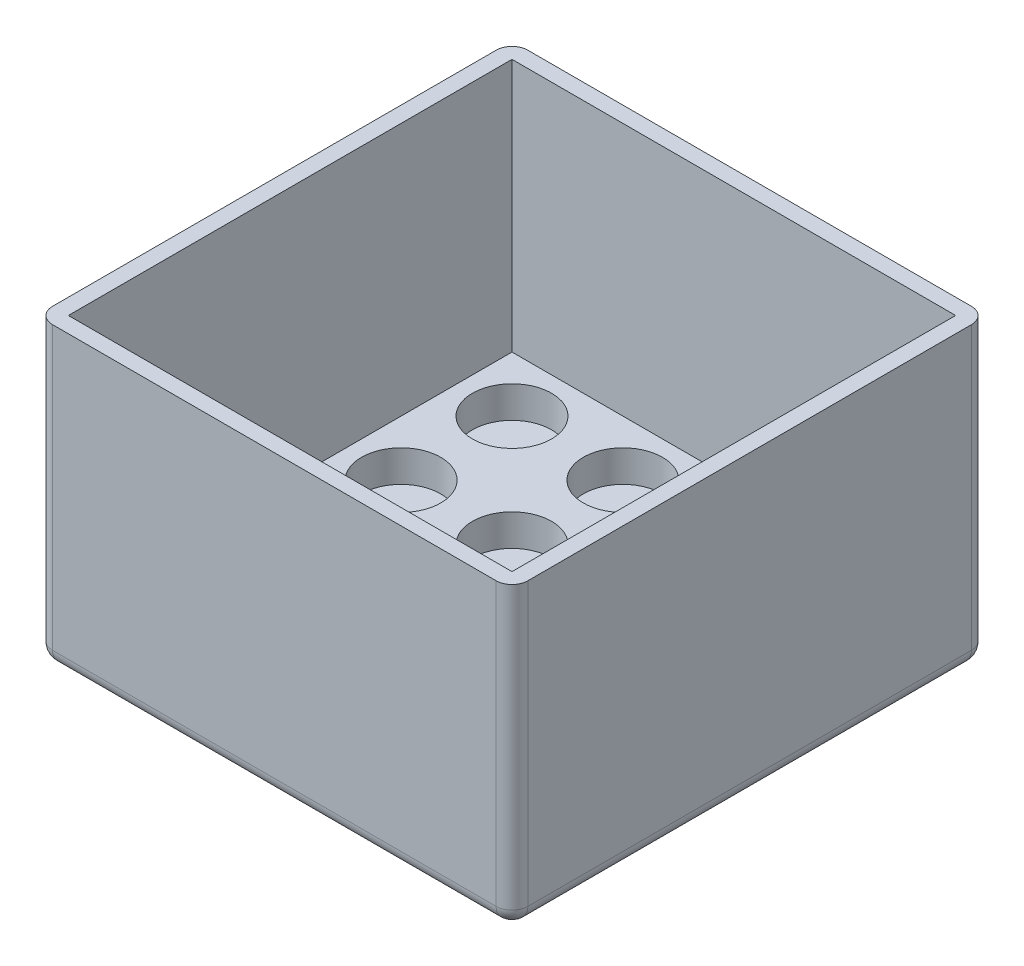
ISO-10303-21;
HEADER;
FILE_DESCRIPTION(('STEP AP214'),'2;1');
FILE_NAME('part.step','',(''),(''),'','','');
FILE_SCHEMA(('AUTOMOTIVE_DESIGN { 1 0 10303 214 1 1 1 1 }'));
ENDSEC;
DATA;
#1=APPLICATION_CONTEXT('core data for automotive mechanical design processes');
#2=APPLICATION_PROTOCOL_DEFINITION('international standard','automotive_design',2000,#1);
#3=PRODUCT_CONTEXT('',#1,'mechanical');
#4=PRODUCT('Part','Part','',(#3));
#5=PRODUCT_RELATED_PRODUCT_CATEGORY('part','',(#4));
#6=PRODUCT_DEFINITION_FORMATION('','',#4);
#7=PRODUCT_DEFINITION_CONTEXT('part definition',#1,'design');
#8=PRODUCT_DEFINITION('design','',#6,#7);
#9=PRODUCT_DEFINITION_SHAPE('','',#8);
#10=(LENGTH_UNIT() NAMED_UNIT(*) SI_UNIT(.MILLI.,.METRE.));
#11=(NAMED_UNIT(*) PLANE_ANGLE_UNIT() SI_UNIT($,.RADIAN.));
#12=(NAMED_UNIT(*) SI_UNIT($,.STERADIAN.) SOLID_ANGLE_UNIT());
#13=UNCERTAINTY_MEASURE_WITH_UNIT(LENGTH_MEASURE(1.E-05),#10,'distance_accuracy_value','');
#14=(GEOMETRIC_REPRESENTATION_CONTEXT(3) GLOBAL_UNCERTAINTY_ASSIGNED_CONTEXT((#13)) GLOBAL_UNIT_ASSIGNED_CONTEXT((#10,
#11,#12)) REPRESENTATION_CONTEXT('',''));
#15=CARTESIAN_POINT('',(0.,0.,0.));
#16=DIRECTION('',(0.,0.,1.));
#17=DIRECTION('',(1.,0.,0.));
#18=AXIS2_PLACEMENT_3D('',#15,#16,#17);
#19=CARTESIAN_POINT('',(0.,90.,0.));
#20=DIRECTION('',(0.,1.,0.));
#21=DIRECTION('',(0.,0.,1.));
#22=AXIS2_PLACEMENT_3D('',#19,#20,#21);
#23=PLANE('',#22);
#24=DIRECTION('',(-1.,0.,0.));
#25=VECTOR('',#24,1.);
#26=CARTESIAN_POINT('',(-5.,90.,-145.));
#27=LINE('',#26,#25);
#28=CARTESIAN_POINT('',(140.,90.,-145.));
#29=VERTEX_POINT('',#28);
#30=CARTESIAN_POINT('',(0.,90.,-145.));
#31=VERTEX_POINT('',#30);
#32=EDGE_CURVE('E243',#29,#31,#27,.T.);
#33=ORIENTED_EDGE('',*,*,#32,.T.);
#34=CARTESIAN_POINT('',(0.,90.,-140.));
#35=DIRECTION('',(0.,1.,0.));
#36=DIRECTION('',(0.,0.,1.));
#37=AXIS2_PLACEMENT_3D('',#34,#35,#36);
#38=CIRCLE('',#37,5.);
#39=CARTESIAN_POINT('',(-5.,90.,-140.));
#40=VERTEX_POINT('',#39);
#41=EDGE_CURVE('E11',#31,#40,#38,.T.);
#42=ORIENTED_EDGE('',*,*,#41,.T.);
#43=DIRECTION('',(0.,0.,1.));
#44=VECTOR('',#43,1.);
#45=CARTESIAN_POINT('',(-5.,90.,-145.));
#46=LINE('',#45,#44);
#47=CARTESIAN_POINT('',(-4.99999999999998,90.,0.));
#48=VERTEX_POINT('',#47);
#49=EDGE_CURVE('E234',#40,#48,#46,.T.);
#50=ORIENTED_EDGE('',*,*,#49,.T.);
#51=CARTESIAN_POINT('',(0.,90.,0.));
#52=DIRECTION('',(0.,1.,0.));
#53=DIRECTION('',(0.,0.,1.));
#54=AXIS2_PLACEMENT_3D('',#51,#52,#53);
#55=CIRCLE('',#54,5.);
#56=CARTESIAN_POINT('',(0.,90.,5.));
#57=VERTEX_POINT('',#56);
#58=EDGE_CURVE('E278',#48,#57,#55,.T.);
#59=ORIENTED_EDGE('',*,*,#58,.T.);
#60=DIRECTION('',(1.,0.,0.));
#61=VECTOR('',#60,1.);
#62=CARTESIAN_POINT('',(-4.99999999999998,90.,5.));
#63=LINE('',#62,#61);
#64=CARTESIAN_POINT('',(140.,90.,5.));
#65=VERTEX_POINT('',#64);
#66=EDGE_CURVE('E237',#57,#65,#63,.T.);
#67=ORIENTED_EDGE('',*,*,#66,.T.);
#68=CARTESIAN_POINT('',(140.,90.,0.));
#69=DIRECTION('',(0.,1.,0.));
#70=DIRECTION('',(0.,0.,1.));
#71=AXIS2_PLACEMENT_3D('',#68,#69,#70);
#72=CIRCLE('',#71,5.);
#73=CARTESIAN_POINT('',(145.,90.,0.));
#74=VERTEX_POINT('',#73);
#75=EDGE_CURVE('E280',#65,#74,#72,.T.);
#76=ORIENTED_EDGE('',*,*,#75,.T.);
#77=DIRECTION('',(0.,0.,-1.));
#78=VECTOR('',#77,1.);
#79=CARTESIAN_POINT('',(145.,90.,-145.));
#80=LINE('',#79,#78);
#81=CARTESIAN_POINT('',(145.,90.,-140.));
#82=VERTEX_POINT('',#81);
#83=EDGE_CURVE('E240',#74,#82,#80,.T.);
#84=ORIENTED_EDGE('',*,*,#83,.T.);
#85=CARTESIAN_POINT('',(140.,90.,-140.));
#86=DIRECTION('',(0.,1.,0.));
#87=DIRECTION('',(0.,0.,1.));
#88=AXIS2_PLACEMENT_3D('',#85,#86,#87);
#89=CIRCLE('',#88,5.);
#90=EDGE_CURVE('E50',#82,#29,#89,.T.);
#91=ORIENTED_EDGE('',*,*,#90,.T.);
#92=EDGE_LOOP('',(#33,#42,#50,#59,#67,#76,#84,#91));
#93=FACE_BOUND('',#92,.T.);
#94=DIRECTION('',(1.,0.,0.));
#95=VECTOR('',#94,1.);
#96=CARTESIAN_POINT('',(0.,90.,0.));
#97=LINE('',#96,#95);
#98=CARTESIAN_POINT('',(0.,90.,0.));
#99=VERTEX_POINT('',#98);
#100=CARTESIAN_POINT('',(140.,90.,0.));
#101=VERTEX_POINT('',#100);
#102=EDGE_CURVE('E223',#99,#101,#97,.T.);
#103=ORIENTED_EDGE('',*,*,#102,.F.);
#104=DIRECTION('',(0.,0.,1.));
#105=VECTOR('',#104,1.);
#106=CARTESIAN_POINT('',(0.,90.,0.));
#107=LINE('',#106,#105);
#108=CARTESIAN_POINT('',(0.,90.,-140.));
#109=VERTEX_POINT('',#108);
#110=EDGE_CURVE('E172',#109,#99,#107,.T.);
#111=ORIENTED_EDGE('',*,*,#110,.F.);
#112=DIRECTION('',(-1.,0.,0.));
#113=VECTOR('',#112,1.);
#114=CARTESIAN_POINT('',(0.,90.,-140.));
#115=LINE('',#114,#113);
#116=CARTESIAN_POINT('',(140.,90.,-140.));
#117=VERTEX_POINT('',#116);
#118=EDGE_CURVE('E148',#117,#109,#115,.T.);
#119=ORIENTED_EDGE('',*,*,#118,.F.);
#120=DIRECTION('',(0.,0.,-1.));
#121=VECTOR('',#120,1.);
#122=CARTESIAN_POINT('',(140.,90.,0.));
#123=LINE('',#122,#121);
#124=EDGE_CURVE('E225',#101,#117,#123,.T.);
#125=ORIENTED_EDGE('',*,*,#124,.F.);
#126=EDGE_LOOP('',(#103,#111,#119,#125));
#127=FACE_BOUND('',#126,.T.);
#128=ADVANCED_FACE('F41',(#93,#127),#23,.T.);
#129=CARTESIAN_POINT('',(-5.,90.,-145.));
#130=DIRECTION('',(1.,0.,0.));
#131=DIRECTION('',(0.,0.,-1.));
#132=AXIS2_PLACEMENT_3D('',#129,#130,#131);
#133=PLANE('',#132);
#134=ORIENTED_EDGE('',*,*,#49,.F.);
#135=DIRECTION('',(0.,-1.,0.));
#136=VECTOR('',#135,1.);
#137=CARTESIAN_POINT('',(-5.,90.,-140.));
#138=LINE('',#137,#136);
#139=CARTESIAN_POINT('',(-5.,1.,-140.));
#140=VERTEX_POINT('',#139);
#141=EDGE_CURVE('E272',#40,#140,#138,.T.);
#142=ORIENTED_EDGE('',*,*,#141,.T.);
#143=DIRECTION('',(0.,0.,-1.));
#144=VECTOR('',#143,1.);
#145=CARTESIAN_POINT('',(-4.99999999999998,1.,5.));
#146=LINE('',#145,#144);
#147=CARTESIAN_POINT('',(-4.99999999999998,1.,0.));
#148=VERTEX_POINT('',#147);
#149=EDGE_CURVE('E270',#140,#148,#146,.F.);
#150=ORIENTED_EDGE('',*,*,#149,.T.);
#151=DIRECTION('',(0.,-1.,0.));
#152=VECTOR('',#151,1.);
#153=CARTESIAN_POINT('',(-4.99999999999998,90.,0.));
#154=LINE('',#153,#152);
#155=EDGE_CURVE('E268',#148,#48,#154,.F.);
#156=ORIENTED_EDGE('',*,*,#155,.T.);
#157=EDGE_LOOP('',(#134,#142,#150,#156));
#158=FACE_BOUND('',#157,.T.);
#159=ADVANCED_FACE('F338',(#158),#133,.F.);
#160=CARTESIAN_POINT('',(-4.99999999999998,90.,5.));
#161=DIRECTION('',(0.,0.,-1.));
#162=DIRECTION('',(-1.,0.,0.));
#163=AXIS2_PLACEMENT_3D('',#160,#161,#162);
#164=PLANE('',#163);
#165=DIRECTION('',(-1.,0.,0.));
#166=VECTOR('',#165,1.);
#167=CARTESIAN_POINT('',(145.,1.,5.));
#168=LINE('',#167,#166);
#169=CARTESIAN_POINT('',(0.,1.,5.));
#170=VERTEX_POINT('',#169);
#171=CARTESIAN_POINT('',(140.,1.,5.));
#172=VERTEX_POINT('',#171);
#173=EDGE_CURVE('E264',#170,#172,#168,.F.);
#174=ORIENTED_EDGE('',*,*,#173,.T.);
#175=DIRECTION('',(0.,-1.,0.));
#176=VECTOR('',#175,1.);
#177=CARTESIAN_POINT('',(140.,90.,5.));
#178=LINE('',#177,#176);
#179=EDGE_CURVE('E266',#172,#65,#178,.F.);
#180=ORIENTED_EDGE('',*,*,#179,.T.);
#181=ORIENTED_EDGE('',*,*,#66,.F.);
#182=DIRECTION('',(0.,-1.,0.));
#183=VECTOR('',#182,1.);
#184=CARTESIAN_POINT('',(0.,90.,5.));
#185=LINE('',#184,#183);
#186=EDGE_CURVE('E262',#57,#170,#185,.T.);
#187=ORIENTED_EDGE('',*,*,#186,.T.);
#188=EDGE_LOOP('',(#174,#180,#181,#187));
#189=FACE_BOUND('',#188,.T.);
#190=ADVANCED_FACE('F350',(#189),#164,.F.);
#191=CARTESIAN_POINT('',(145.,90.,-145.));
#192=DIRECTION('',(-1.,0.,0.));
#193=DIRECTION('',(0.,0.,1.));
#194=AXIS2_PLACEMENT_3D('',#191,#192,#193);
#195=PLANE('',#194);
#196=DIRECTION('',(0.,0.,1.));
#197=VECTOR('',#196,1.);
#198=CARTESIAN_POINT('',(145.,1.,-145.));
#199=LINE('',#198,#197);
#200=CARTESIAN_POINT('',(145.,1.,0.));
#201=VERTEX_POINT('',#200);
#202=CARTESIAN_POINT('',(145.,1.,-140.));
#203=VERTEX_POINT('',#202);
#204=EDGE_CURVE('E257',#201,#203,#199,.F.);
#205=ORIENTED_EDGE('',*,*,#204,.T.);
#206=DIRECTION('',(0.,-1.,0.));
#207=VECTOR('',#206,1.);
#208=CARTESIAN_POINT('',(145.,90.,-140.));
#209=LINE('',#208,#207);
#210=EDGE_CURVE('E260',#203,#82,#209,.F.);
#211=ORIENTED_EDGE('',*,*,#210,.T.);
#212=ORIENTED_EDGE('',*,*,#83,.F.);
#213=DIRECTION('',(0.,-1.,0.));
#214=VECTOR('',#213,1.);
#215=CARTESIAN_POINT('',(145.,90.,0.));
#216=LINE('',#215,#214);
#217=EDGE_CURVE('E255',#74,#201,#216,.T.);
#218=ORIENTED_EDGE('',*,*,#217,.T.);
#219=EDGE_LOOP('',(#205,#211,#212,#218));
#220=FACE_BOUND('',#219,.T.);
#221=ADVANCED_FACE('F367',(#220),#195,.F.);
#222=CARTESIAN_POINT('',(-5.,90.,-145.));
#223=DIRECTION('',(0.,0.,1.));
#224=DIRECTION('',(1.,0.,0.));
#225=AXIS2_PLACEMENT_3D('',#222,#223,#224);
#226=PLANE('',#225);
#227=DIRECTION('',(1.,0.,0.));
#228=VECTOR('',#227,1.);
#229=CARTESIAN_POINT('',(-4.99999999999998,1.,-145.));
#230=LINE('',#229,#228);
#231=CARTESIAN_POINT('',(140.,1.,-145.));
#232=VERTEX_POINT('',#231);
#233=CARTESIAN_POINT('',(0.,1.,-145.));
#234=VERTEX_POINT('',#233);
#235=EDGE_CURVE('E58',#232,#234,#230,.F.);
#236=ORIENTED_EDGE('',*,*,#235,.T.);
#237=DIRECTION('',(0.,-1.,0.));
#238=VECTOR('',#237,1.);
#239=CARTESIAN_POINT('',(0.,90.,-145.));
#240=LINE('',#239,#238);
#241=EDGE_CURVE('E276',#234,#31,#240,.F.);
#242=ORIENTED_EDGE('',*,*,#241,.T.);
#243=ORIENTED_EDGE('',*,*,#32,.F.);
#244=DIRECTION('',(0.,-1.,0.));
#245=VECTOR('',#244,1.);
#246=CARTESIAN_POINT('',(140.,90.,-145.));
#247=LINE('',#246,#245);
#248=EDGE_CURVE('E63',#29,#232,#247,.T.);
#249=ORIENTED_EDGE('',*,*,#248,.T.);
#250=EDGE_LOOP('',(#236,#242,#243,#249));
#251=FACE_BOUND('',#250,.T.);
#252=ADVANCED_FACE('F392',(#251),#226,.F.);
#253=CARTESIAN_POINT('',(0.,90.,0.));
#254=DIRECTION('',(1.,0.,0.));
#255=DIRECTION('',(0.,0.,-1.));
#256=AXIS2_PLACEMENT_3D('',#253,#254,#255);
#257=PLANE('',#256);
#258=DIRECTION('',(0.,0.,1.));
#259=VECTOR('',#258,1.);
#260=CARTESIAN_POINT('',(0.,10.,0.));
#261=LINE('',#260,#259);
#262=CARTESIAN_POINT('',(0.,10.,-140.));
#263=VERTEX_POINT('',#262);
#264=CARTESIAN_POINT('',(0.,10.,0.));
#265=VERTEX_POINT('',#264);
#266=EDGE_CURVE('E155',#263,#265,#261,.T.);
#267=ORIENTED_EDGE('',*,*,#266,.F.);
#268=DIRECTION('',(0.,-1.,0.));
#269=VECTOR('',#268,1.);
#270=CARTESIAN_POINT('',(0.,90.,-140.));
#271=LINE('',#270,#269);
#272=EDGE_CURVE('E141',#109,#263,#271,.T.);
#273=ORIENTED_EDGE('',*,*,#272,.F.);
#274=ORIENTED_EDGE('',*,*,#110,.T.);
#275=DIRECTION('',(0.,-1.,0.));
#276=VECTOR('',#275,1.);
#277=CARTESIAN_POINT('',(0.,90.,0.));
#278=LINE('',#277,#276);
#279=EDGE_CURVE('E158',#99,#265,#278,.T.);
#280=ORIENTED_EDGE('',*,*,#279,.T.);
#281=EDGE_LOOP('',(#267,#273,#274,#280));
#282=FACE_BOUND('',#281,.T.);
#283=ADVANCED_FACE('F156',(#282),#257,.T.);
#284=CARTESIAN_POINT('',(0.,90.,0.));
#285=DIRECTION('',(0.,0.,-1.));
#286=DIRECTION('',(-1.,0.,0.));
#287=AXIS2_PLACEMENT_3D('',#284,#285,#286);
#288=PLANE('',#287);
#289=DIRECTION('',(1.,0.,0.));
#290=VECTOR('',#289,1.);
#291=CARTESIAN_POINT('',(0.,10.,0.));
#292=LINE('',#291,#290);
#293=CARTESIAN_POINT('',(140.,10.,0.));
#294=VERTEX_POINT('',#293);
#295=EDGE_CURVE('E161',#265,#294,#292,.T.);
#296=ORIENTED_EDGE('',*,*,#295,.F.);
#297=ORIENTED_EDGE('',*,*,#279,.F.);
#298=ORIENTED_EDGE('',*,*,#102,.T.);
#299=DIRECTION('',(0.,-1.,0.));
#300=VECTOR('',#299,1.);
#301=CARTESIAN_POINT('',(140.,90.,0.));
#302=LINE('',#301,#300);
#303=EDGE_CURVE('E230',#101,#294,#302,.T.);
#304=ORIENTED_EDGE('',*,*,#303,.T.);
#305=EDGE_LOOP('',(#296,#297,#298,#304));
#306=FACE_BOUND('',#305,.T.);
#307=ADVANCED_FACE('F892',(#306),#288,.T.);
#308=CARTESIAN_POINT('',(140.,90.,0.));
#309=DIRECTION('',(-1.,0.,0.));
#310=DIRECTION('',(0.,0.,1.));
#311=AXIS2_PLACEMENT_3D('',#308,#309,#310);
#312=PLANE('',#311);
#313=DIRECTION('',(0.,0.,-1.));
#314=VECTOR('',#313,1.);
#315=CARTESIAN_POINT('',(140.,10.,0.));
#316=LINE('',#315,#314);
#317=CARTESIAN_POINT('',(140.,10.,-140.));
#318=VERTEX_POINT('',#317);
#319=EDGE_CURVE('E165',#294,#318,#316,.T.);
#320=ORIENTED_EDGE('',*,*,#319,.F.);
#321=ORIENTED_EDGE('',*,*,#303,.F.);
#322=ORIENTED_EDGE('',*,*,#124,.T.);
#323=DIRECTION('',(0.,-1.,0.));
#324=VECTOR('',#323,1.);
#325=CARTESIAN_POINT('',(140.,90.,-140.));
#326=LINE('',#325,#324);
#327=EDGE_CURVE('E151',#117,#318,#326,.T.);
#328=ORIENTED_EDGE('',*,*,#327,.T.);
#329=EDGE_LOOP('',(#320,#321,#322,#328));
#330=FACE_BOUND('',#329,.T.);
#331=ADVANCED_FACE('F882',(#330),#312,.T.);
#332=CARTESIAN_POINT('',(0.,90.,-140.));
#333=DIRECTION('',(0.,0.,1.));
#334=DIRECTION('',(1.,0.,0.));
#335=AXIS2_PLACEMENT_3D('',#332,#333,#334);
#336=PLANE('',#335);
#337=DIRECTION('',(-1.,0.,0.));
#338=VECTOR('',#337,1.);
#339=CARTESIAN_POINT('',(0.,10.,-140.));
#340=LINE('',#339,#338);
#341=EDGE_CURVE('E145',#318,#263,#340,.T.);
#342=ORIENTED_EDGE('',*,*,#341,.F.);
#343=ORIENTED_EDGE('',*,*,#327,.F.);
#344=ORIENTED_EDGE('',*,*,#118,.T.);
#345=ORIENTED_EDGE('',*,*,#272,.T.);
#346=EDGE_LOOP('',(#342,#343,#344,#345));
#347=FACE_BOUND('',#346,.T.);
#348=ADVANCED_FACE('F143',(#347),#336,.T.);
#349=CARTESIAN_POINT('',(0.,-4.,0.));
#350=DIRECTION('',(0.,-1.,0.));
#351=DIRECTION('',(0.,0.,-1.));
#352=AXIS2_PLACEMENT_3D('',#349,#350,#351);
#353=PLANE('',#352);
#354=DIRECTION('',(1.,0.,0.));
#355=VECTOR('',#354,1.);
#356=CARTESIAN_POINT('',(145.,-4.,-140.));
#357=LINE('',#356,#355);
#358=CARTESIAN_POINT('',(0.,-4.,-140.));
#359=VERTEX_POINT('',#358);
#360=CARTESIAN_POINT('',(140.,-4.,-140.));
#361=VERTEX_POINT('',#360);
#362=EDGE_CURVE('E246',#359,#361,#357,.T.);
#363=ORIENTED_EDGE('',*,*,#362,.T.);
#364=DIRECTION('',(0.,0.,1.));
#365=VECTOR('',#364,1.);
#366=CARTESIAN_POINT('',(140.,-4.,5.));
#367=LINE('',#366,#365);
#368=CARTESIAN_POINT('',(140.,-4.,0.));
#369=VERTEX_POINT('',#368);
#370=EDGE_CURVE('E252',#361,#369,#367,.T.);
#371=ORIENTED_EDGE('',*,*,#370,.T.);
#372=DIRECTION('',(-1.,0.,0.));
#373=VECTOR('',#372,1.);
#374=CARTESIAN_POINT('',(-4.99999999999998,-4.,0.));
#375=LINE('',#374,#373);
#376=CARTESIAN_POINT('',(0.,-4.,0.));
#377=VERTEX_POINT('',#376);
#378=EDGE_CURVE('E250',#369,#377,#375,.T.);
#379=ORIENTED_EDGE('',*,*,#378,.T.);
#380=DIRECTION('',(0.,0.,-1.));
#381=VECTOR('',#380,1.);
#382=CARTESIAN_POINT('',(0.,-4.,-145.));
#383=LINE('',#382,#381);
#384=EDGE_CURVE('E248',#377,#359,#383,.T.);
#385=ORIENTED_EDGE('',*,*,#384,.T.);
#386=EDGE_LOOP('',(#363,#371,#379,#385));
#387=FACE_BOUND('',#386,.T.);
#388=ADVANCED_FACE('F327',(#387),#353,.T.);
#389=CARTESIAN_POINT('',(17.4999999999999,10.,-122.5));
#390=DIRECTION('',(0.,-1.,0.));
#391=DIRECTION('',(0.,0.,-1.));
#392=AXIS2_PLACEMENT_3D('',#389,#390,#391);
#393=CYLINDRICAL_SURFACE('',#392,12.5);
#394=CARTESIAN_POINT('',(17.4999999999999,10.,-122.5));
#395=DIRECTION('',(0.,1.,0.));
#396=DIRECTION('',(0.,0.,1.));
#397=AXIS2_PLACEMENT_3D('',#394,#395,#396);
#398=CIRCLE('',#397,12.5);
#399=CARTESIAN_POINT('',(17.4999999999999,10.,-110.));
#400=VERTEX_POINT('',#399);
#401=EDGE_CURVE('E167',#400,#400,#398,.T.);
#402=ORIENTED_EDGE('',*,*,#401,.T.);
#403=EDGE_LOOP('',(#402));
#404=FACE_BOUND('',#403,.T.);
#405=CARTESIAN_POINT('',(17.4999999999999,0.,-122.5));
#406=DIRECTION('',(0.,1.,0.));
#407=DIRECTION('',(0.,0.,1.));
#408=AXIS2_PLACEMENT_3D('',#405,#406,#407);
#409=CIRCLE('',#408,12.5);
#410=CARTESIAN_POINT('',(17.4999999999999,0.,-110.));
#411=VERTEX_POINT('',#410);
#412=EDGE_CURVE('E218',#411,#411,#409,.T.);
#413=ORIENTED_EDGE('',*,*,#412,.F.);
#414=EDGE_LOOP('',(#413));
#415=FACE_BOUND('',#414,.T.);
#416=ADVANCED_FACE('F503',(#404,#415),#393,.F.);
#417=CARTESIAN_POINT('',(52.5,10.,-122.5));
#418=DIRECTION('',(0.,-1.,0.));
#419=DIRECTION('',(0.,0.,-1.));
#420=AXIS2_PLACEMENT_3D('',#417,#418,#419);
#421=CYLINDRICAL_SURFACE('',#420,12.5);
#422=CARTESIAN_POINT('',(52.5,10.,-122.5));
#423=DIRECTION('',(0.,1.,0.));
#424=DIRECTION('',(0.,0.,1.));
#425=AXIS2_PLACEMENT_3D('',#422,#423,#424);
#426=CIRCLE('',#425,12.5);
#427=CARTESIAN_POINT('',(52.5,10.,-110.));
#428=VERTEX_POINT('',#427);
#429=EDGE_CURVE('E979',#428,#428,#426,.T.);
#430=ORIENTED_EDGE('',*,*,#429,.T.);
#431=EDGE_LOOP('',(#430));
#432=FACE_BOUND('',#431,.T.);
#433=CARTESIAN_POINT('',(52.5,0.,-122.5));
#434=DIRECTION('',(0.,1.,0.));
#435=DIRECTION('',(0.,0.,1.));
#436=AXIS2_PLACEMENT_3D('',#433,#434,#435);
#437=CIRCLE('',#436,12.5);
#438=CARTESIAN_POINT('',(52.5,0.,-110.));
#439=VERTEX_POINT('',#438);
#440=EDGE_CURVE('E215',#439,#439,#437,.T.);
#441=ORIENTED_EDGE('',*,*,#440,.F.);
#442=EDGE_LOOP('',(#441));
#443=FACE_BOUND('',#442,.T.);
#444=ADVANCED_FACE('F855',(#432,#443),#421,.F.);
#445=CARTESIAN_POINT('',(87.5,10.,-122.500000000001));
#446=DIRECTION('',(0.,-1.,0.));
#447=DIRECTION('',(0.,0.,-1.));
#448=AXIS2_PLACEMENT_3D('',#445,#446,#447);
#449=CYLINDRICAL_SURFACE('',#448,12.5);
#450=CARTESIAN_POINT('',(87.5,10.,-122.500000000001));
#451=DIRECTION('',(0.,1.,0.));
#452=DIRECTION('',(0.,0.,1.));
#453=AXIS2_PLACEMENT_3D('',#450,#451,#452);
#454=CIRCLE('',#453,12.5);
#455=CARTESIAN_POINT('',(87.5,10.,-110.000000000001));
#456=VERTEX_POINT('',#455);
#457=EDGE_CURVE('E981',#456,#456,#454,.T.);
#458=ORIENTED_EDGE('',*,*,#457,.T.);
#459=EDGE_LOOP('',(#458));
#460=FACE_BOUND('',#459,.T.);
#461=CARTESIAN_POINT('',(87.5,0.,-122.500000000001));
#462=DIRECTION('',(0.,1.,0.));
#463=DIRECTION('',(0.,0.,1.));
#464=AXIS2_PLACEMENT_3D('',#461,#462,#463);
#465=CIRCLE('',#464,12.5);
#466=CARTESIAN_POINT('',(87.5,0.,-110.000000000001));
#467=VERTEX_POINT('',#466);
#468=EDGE_CURVE('E212',#467,#467,#465,.T.);
#469=ORIENTED_EDGE('',*,*,#468,.F.);
#470=EDGE_LOOP('',(#469));
#471=FACE_BOUND('',#470,.T.);
#472=ADVANCED_FACE('F844',(#460,#471),#449,.F.);
#473=CARTESIAN_POINT('',(122.5,10.,-122.500000000001));
#474=DIRECTION('',(0.,-1.,0.));
#475=DIRECTION('',(0.,0.,-1.));
#476=AXIS2_PLACEMENT_3D('',#473,#474,#475);
#477=CYLINDRICAL_SURFACE('',#476,12.5);
#478=CARTESIAN_POINT('',(122.5,10.,-122.500000000001));
#479=DIRECTION('',(0.,1.,0.));
#480=DIRECTION('',(0.,0.,1.));
#481=AXIS2_PLACEMENT_3D('',#478,#479,#480);
#482=CIRCLE('',#481,12.5);
#483=CARTESIAN_POINT('',(122.5,10.,-110.000000000002));
#484=VERTEX_POINT('',#483);
#485=EDGE_CURVE('E986',#484,#484,#482,.T.);
#486=ORIENTED_EDGE('',*,*,#485,.T.);
#487=EDGE_LOOP('',(#486));
#488=FACE_BOUND('',#487,.T.);
#489=CARTESIAN_POINT('',(122.5,0.,-122.500000000001));
#490=DIRECTION('',(0.,1.,0.));
#491=DIRECTION('',(0.,0.,1.));
#492=AXIS2_PLACEMENT_3D('',#489,#490,#491);
#493=CIRCLE('',#492,12.5);
#494=CARTESIAN_POINT('',(122.5,0.,-110.000000000002));
#495=VERTEX_POINT('',#494);
#496=EDGE_CURVE('E209',#495,#495,#493,.T.);
#497=ORIENTED_EDGE('',*,*,#496,.F.);
#498=EDGE_LOOP('',(#497));
#499=FACE_BOUND('',#498,.T.);
#500=ADVANCED_FACE('F833',(#488,#499),#477,.F.);
#501=CARTESIAN_POINT('',(52.5000000000003,10.,-87.5000000000005));
#502=DIRECTION('',(0.,-1.,0.));
#503=DIRECTION('',(0.,0.,-1.));
#504=AXIS2_PLACEMENT_3D('',#501,#502,#503);
#505=CYLINDRICAL_SURFACE('',#504,12.5);
#506=CARTESIAN_POINT('',(52.5000000000003,10.,-87.5000000000005));
#507=DIRECTION('',(0.,1.,0.));
#508=DIRECTION('',(0.,0.,1.));
#509=AXIS2_PLACEMENT_3D('',#506,#507,#508);
#510=CIRCLE('',#509,12.5);
#511=CARTESIAN_POINT('',(52.5000000000003,10.,-75.0000000000005));
#512=VERTEX_POINT('',#511);
#513=EDGE_CURVE('E989',#512,#512,#510,.T.);
#514=ORIENTED_EDGE('',*,*,#513,.T.);
#515=EDGE_LOOP('',(#514));
#516=FACE_BOUND('',#515,.T.);
#517=CARTESIAN_POINT('',(52.5000000000003,0.,-87.5000000000005));
#518=DIRECTION('',(0.,1.,0.));
#519=DIRECTION('',(0.,0.,1.));
#520=AXIS2_PLACEMENT_3D('',#517,#518,#519);
#521=CIRCLE('',#520,12.5);
#522=CARTESIAN_POINT('',(52.5000000000003,0.,-75.0000000000005));
#523=VERTEX_POINT('',#522);
#524=EDGE_CURVE('E206',#523,#523,#521,.T.);
#525=ORIENTED_EDGE('',*,*,#524,.F.);
#526=EDGE_LOOP('',(#525));
#527=FACE_BOUND('',#526,.T.);
#528=ADVANCED_FACE('F822',(#516,#527),#505,.F.);
#529=CARTESIAN_POINT('',(87.5000000000003,10.,-87.500000000001));
#530=DIRECTION('',(0.,-1.,0.));
#531=DIRECTION('',(0.,0.,-1.));
#532=AXIS2_PLACEMENT_3D('',#529,#530,#531);
#533=CYLINDRICAL_SURFACE('',#532,12.5);
#534=CARTESIAN_POINT('',(87.5000000000003,10.,-87.500000000001));
#535=DIRECTION('',(0.,1.,0.));
#536=DIRECTION('',(0.,0.,1.));
#537=AXIS2_PLACEMENT_3D('',#534,#535,#536);
#538=CIRCLE('',#537,12.5);
#539=CARTESIAN_POINT('',(87.5000000000003,10.,-75.000000000001));
#540=VERTEX_POINT('',#539);
#541=EDGE_CURVE('E992',#540,#540,#538,.T.);
#542=ORIENTED_EDGE('',*,*,#541,.T.);
#543=EDGE_LOOP('',(#542));
#544=FACE_BOUND('',#543,.T.);
#545=CARTESIAN_POINT('',(87.5000000000003,0.,-87.500000000001));
#546=DIRECTION('',(0.,1.,0.));
#547=DIRECTION('',(0.,0.,1.));
#548=AXIS2_PLACEMENT_3D('',#545,#546,#547);
#549=CIRCLE('',#548,12.5);
#550=CARTESIAN_POINT('',(87.5000000000003,0.,-75.000000000001));
#551=VERTEX_POINT('',#550);
#552=EDGE_CURVE('E203',#551,#551,#549,.T.);
#553=ORIENTED_EDGE('',*,*,#552,.F.);
#554=EDGE_LOOP('',(#553));
#555=FACE_BOUND('',#554,.T.);
#556=ADVANCED_FACE('F811',(#544,#555),#533,.F.);
#557=CARTESIAN_POINT('',(122.5,10.,-87.5000000000015));
#558=DIRECTION('',(0.,-1.,0.));
#559=DIRECTION('',(0.,0.,-1.));
#560=AXIS2_PLACEMENT_3D('',#557,#558,#559);
#561=CYLINDRICAL_SURFACE('',#560,12.5);
#562=CARTESIAN_POINT('',(122.5,10.,-87.5000000000015));
#563=DIRECTION('',(0.,1.,0.));
#564=DIRECTION('',(0.,0.,1.));
#565=AXIS2_PLACEMENT_3D('',#562,#563,#564);
#566=CIRCLE('',#565,12.5);
#567=CARTESIAN_POINT('',(122.5,10.,-75.0000000000014));
#568=VERTEX_POINT('',#567);
#569=EDGE_CURVE('E995',#568,#568,#566,.T.);
#570=ORIENTED_EDGE('',*,*,#569,.T.);
#571=EDGE_LOOP('',(#570));
#572=FACE_BOUND('',#571,.T.);
#573=CARTESIAN_POINT('',(122.5,0.,-87.5000000000015));
#574=DIRECTION('',(0.,1.,0.));
#575=DIRECTION('',(0.,0.,1.));
#576=AXIS2_PLACEMENT_3D('',#573,#574,#575);
#577=CIRCLE('',#576,12.5);
#578=CARTESIAN_POINT('',(122.5,0.,-75.0000000000014));
#579=VERTEX_POINT('',#578);
#580=EDGE_CURVE('E200',#579,#579,#577,.T.);
#581=ORIENTED_EDGE('',*,*,#580,.F.);
#582=EDGE_LOOP('',(#581));
#583=FACE_BOUND('',#582,.T.);
#584=ADVANCED_FACE('F800',(#572,#583),#561,.F.);
#585=CARTESIAN_POINT('',(52.5000000000007,10.,-52.5000000000005));
#586=DIRECTION('',(0.,-1.,0.));
#587=DIRECTION('',(0.,0.,-1.));
#588=AXIS2_PLACEMENT_3D('',#585,#586,#587);
#589=CYLINDRICAL_SURFACE('',#588,12.5);
#590=CARTESIAN_POINT('',(52.5000000000007,10.,-52.5000000000005));
#591=DIRECTION('',(0.,1.,0.));
#592=DIRECTION('',(0.,0.,1.));
#593=AXIS2_PLACEMENT_3D('',#590,#591,#592);
#594=CIRCLE('',#593,12.5);
#595=CARTESIAN_POINT('',(52.5000000000007,10.,-40.0000000000005));
#596=VERTEX_POINT('',#595);
#597=EDGE_CURVE('E998',#596,#596,#594,.T.);
#598=ORIENTED_EDGE('',*,*,#597,.T.);
#599=EDGE_LOOP('',(#598));
#600=FACE_BOUND('',#599,.T.);
#601=CARTESIAN_POINT('',(52.5000000000007,0.,-52.5000000000005));
#602=DIRECTION('',(0.,1.,0.));
#603=DIRECTION('',(0.,0.,1.));
#604=AXIS2_PLACEMENT_3D('',#601,#602,#603);
#605=CIRCLE('',#604,12.5);
#606=CARTESIAN_POINT('',(52.5000000000007,0.,-40.0000000000005));
#607=VERTEX_POINT('',#606);
#608=EDGE_CURVE('E197',#607,#607,#605,.T.);
#609=ORIENTED_EDGE('',*,*,#608,.F.);
#610=EDGE_LOOP('',(#609));
#611=FACE_BOUND('',#610,.T.);
#612=ADVANCED_FACE('F789',(#600,#611),#589,.F.);
#613=CARTESIAN_POINT('',(87.5000000000007,10.,-52.500000000001));
#614=DIRECTION('',(0.,-1.,0.));
#615=DIRECTION('',(0.,0.,-1.));
#616=AXIS2_PLACEMENT_3D('',#613,#614,#615);
#617=CYLINDRICAL_SURFACE('',#616,12.5);
#618=CARTESIAN_POINT('',(87.5000000000007,10.,-52.500000000001));
#619=DIRECTION('',(0.,1.,0.));
#620=DIRECTION('',(0.,0.,1.));
#621=AXIS2_PLACEMENT_3D('',#618,#619,#620);
#622=CIRCLE('',#621,12.5);
#623=CARTESIAN_POINT('',(87.5000000000007,10.,-40.000000000001));
#624=VERTEX_POINT('',#623);
#625=EDGE_CURVE('E1001',#624,#624,#622,.T.);
#626=ORIENTED_EDGE('',*,*,#625,.T.);
#627=EDGE_LOOP('',(#626));
#628=FACE_BOUND('',#627,.T.);
#629=CARTESIAN_POINT('',(87.5000000000007,0.,-52.500000000001));
#630=DIRECTION('',(0.,1.,0.));
#631=DIRECTION('',(0.,0.,1.));
#632=AXIS2_PLACEMENT_3D('',#629,#630,#631);
#633=CIRCLE('',#632,12.5);
#634=CARTESIAN_POINT('',(87.5000000000007,0.,-40.000000000001));
#635=VERTEX_POINT('',#634);
#636=EDGE_CURVE('E194',#635,#635,#633,.T.);
#637=ORIENTED_EDGE('',*,*,#636,.F.);
#638=EDGE_LOOP('',(#637));
#639=FACE_BOUND('',#638,.T.);
#640=ADVANCED_FACE('F778',(#628,#639),#617,.F.);
#641=CARTESIAN_POINT('',(122.500000000001,10.,-52.5000000000015));
#642=DIRECTION('',(0.,-1.,0.));
#643=DIRECTION('',(0.,0.,-1.));
#644=AXIS2_PLACEMENT_3D('',#641,#642,#643);
#645=CYLINDRICAL_SURFACE('',#644,12.5);
#646=CARTESIAN_POINT('',(122.500000000001,10.,-52.5000000000015));
#647=DIRECTION('',(0.,1.,0.));
#648=DIRECTION('',(0.,0.,1.));
#649=AXIS2_PLACEMENT_3D('',#646,#647,#648);
#650=CIRCLE('',#649,12.5);
#651=CARTESIAN_POINT('',(122.500000000001,10.,-40.0000000000015));
#652=VERTEX_POINT('',#651);
#653=EDGE_CURVE('E1004',#652,#652,#650,.T.);
#654=ORIENTED_EDGE('',*,*,#653,.T.);
#655=EDGE_LOOP('',(#654));
#656=FACE_BOUND('',#655,.T.);
#657=CARTESIAN_POINT('',(122.500000000001,0.,-52.5000000000015));
#658=DIRECTION('',(0.,1.,0.));
#659=DIRECTION('',(0.,0.,1.));
#660=AXIS2_PLACEMENT_3D('',#657,#658,#659);
#661=CIRCLE('',#660,12.5);
#662=CARTESIAN_POINT('',(122.500000000001,0.,-40.0000000000015));
#663=VERTEX_POINT('',#662);
#664=EDGE_CURVE('E191',#663,#663,#661,.T.);
#665=ORIENTED_EDGE('',*,*,#664,.F.);
#666=EDGE_LOOP('',(#665));
#667=FACE_BOUND('',#666,.T.);
#668=ADVANCED_FACE('F767',(#656,#667),#645,.F.);
#669=CARTESIAN_POINT('',(52.500000000001,10.,-17.5000000000005));
#670=DIRECTION('',(0.,-1.,0.));
#671=DIRECTION('',(0.,0.,-1.));
#672=AXIS2_PLACEMENT_3D('',#669,#670,#671);
#673=CYLINDRICAL_SURFACE('',#672,12.5);
#674=CARTESIAN_POINT('',(52.500000000001,10.,-17.5000000000005));
#675=DIRECTION('',(0.,1.,0.));
#676=DIRECTION('',(0.,0.,1.));
#677=AXIS2_PLACEMENT_3D('',#674,#675,#676);
#678=CIRCLE('',#677,12.5);
#679=CARTESIAN_POINT('',(52.500000000001,10.,-5.00000000000049));
#680=VERTEX_POINT('',#679);
#681=EDGE_CURVE('E1007',#680,#680,#678,.T.);
#682=ORIENTED_EDGE('',*,*,#681,.T.);
#683=EDGE_LOOP('',(#682));
#684=FACE_BOUND('',#683,.T.);
#685=CARTESIAN_POINT('',(52.500000000001,0.,-17.5000000000005));
#686=DIRECTION('',(0.,1.,0.));
#687=DIRECTION('',(0.,0.,1.));
#688=AXIS2_PLACEMENT_3D('',#685,#686,#687);
#689=CIRCLE('',#688,12.5);
#690=CARTESIAN_POINT('',(52.500000000001,0.,-5.00000000000049));
#691=VERTEX_POINT('',#690);
#692=EDGE_CURVE('E188',#691,#691,#689,.T.);
#693=ORIENTED_EDGE('',*,*,#692,.F.);
#694=EDGE_LOOP('',(#693));
#695=FACE_BOUND('',#694,.T.);
#696=ADVANCED_FACE('F756',(#684,#695),#673,.F.);
#697=CARTESIAN_POINT('',(87.5000000000011,10.,-17.500000000001));
#698=DIRECTION('',(0.,-1.,0.));
#699=DIRECTION('',(0.,0.,-1.));
#700=AXIS2_PLACEMENT_3D('',#697,#698,#699);
#701=CYLINDRICAL_SURFACE('',#700,12.5);
#702=CARTESIAN_POINT('',(87.5000000000011,10.,-17.500000000001));
#703=DIRECTION('',(0.,1.,0.));
#704=DIRECTION('',(0.,0.,1.));
#705=AXIS2_PLACEMENT_3D('',#702,#703,#704);
#706=CIRCLE('',#705,12.5);
#707=CARTESIAN_POINT('',(87.5000000000011,10.,-5.00000000000097));
#708=VERTEX_POINT('',#707);
#709=EDGE_CURVE('E1010',#708,#708,#706,.T.);
#710=ORIENTED_EDGE('',*,*,#709,.T.);
#711=EDGE_LOOP('',(#710));
#712=FACE_BOUND('',#711,.T.);
#713=CARTESIAN_POINT('',(87.5000000000011,0.,-17.500000000001));
#714=DIRECTION('',(0.,1.,0.));
#715=DIRECTION('',(0.,0.,1.));
#716=AXIS2_PLACEMENT_3D('',#713,#714,#715);
#717=CIRCLE('',#716,12.5);
#718=CARTESIAN_POINT('',(87.5000000000011,0.,-5.00000000000097));
#719=VERTEX_POINT('',#718);
#720=EDGE_CURVE('E185',#719,#719,#717,.T.);
#721=ORIENTED_EDGE('',*,*,#720,.F.);
#722=EDGE_LOOP('',(#721));
#723=FACE_BOUND('',#722,.T.);
#724=ADVANCED_FACE('F745',(#712,#723),#701,.F.);
#725=CARTESIAN_POINT('',(122.500000000001,10.,-17.5000000000015));
#726=DIRECTION('',(0.,-1.,0.));
#727=DIRECTION('',(0.,0.,-1.));
#728=AXIS2_PLACEMENT_3D('',#725,#726,#727);
#729=CYLINDRICAL_SURFACE('',#728,12.5);
#730=CARTESIAN_POINT('',(122.500000000001,10.,-17.5000000000015));
#731=DIRECTION('',(0.,1.,0.));
#732=DIRECTION('',(0.,0.,1.));
#733=AXIS2_PLACEMENT_3D('',#730,#731,#732);
#734=CIRCLE('',#733,12.5);
#735=CARTESIAN_POINT('',(122.500000000001,10.,-5.00000000000147));
#736=VERTEX_POINT('',#735);
#737=EDGE_CURVE('E1013',#736,#736,#734,.T.);
#738=ORIENTED_EDGE('',*,*,#737,.T.);
#739=EDGE_LOOP('',(#738));
#740=FACE_BOUND('',#739,.T.);
#741=CARTESIAN_POINT('',(122.500000000001,0.,-17.5000000000015));
#742=DIRECTION('',(0.,1.,0.));
#743=DIRECTION('',(0.,0.,1.));
#744=AXIS2_PLACEMENT_3D('',#741,#742,#743);
#745=CIRCLE('',#744,12.5);
#746=CARTESIAN_POINT('',(122.500000000001,0.,-5.00000000000147));
#747=VERTEX_POINT('',#746);
#748=EDGE_CURVE('E182',#747,#747,#745,.T.);
#749=ORIENTED_EDGE('',*,*,#748,.F.);
#750=EDGE_LOOP('',(#749));
#751=FACE_BOUND('',#750,.T.);
#752=ADVANCED_FACE('F734',(#740,#751),#729,.F.);
#753=CARTESIAN_POINT('',(17.5000000000003,10.,-87.5));
#754=DIRECTION('',(0.,-1.,0.));
#755=DIRECTION('',(0.,0.,-1.));
#756=AXIS2_PLACEMENT_3D('',#753,#754,#755);
#757=CYLINDRICAL_SURFACE('',#756,12.5);
#758=CARTESIAN_POINT('',(17.5000000000003,10.,-87.5));
#759=DIRECTION('',(0.,1.,0.));
#760=DIRECTION('',(0.,0.,1.));
#761=AXIS2_PLACEMENT_3D('',#758,#759,#760);
#762=CIRCLE('',#761,12.5);
#763=CARTESIAN_POINT('',(17.5000000000003,10.,-75.));
#764=VERTEX_POINT('',#763);
#765=EDGE_CURVE('E1016',#764,#764,#762,.T.);
#766=ORIENTED_EDGE('',*,*,#765,.T.);
#767=EDGE_LOOP('',(#766));
#768=FACE_BOUND('',#767,.T.);
#769=CARTESIAN_POINT('',(17.5000000000003,0.,-87.5));
#770=DIRECTION('',(0.,1.,0.));
#771=DIRECTION('',(0.,0.,1.));
#772=AXIS2_PLACEMENT_3D('',#769,#770,#771);
#773=CIRCLE('',#772,12.5);
#774=CARTESIAN_POINT('',(17.5000000000003,0.,-75.));
#775=VERTEX_POINT('',#774);
#776=EDGE_CURVE('E179',#775,#775,#773,.T.);
#777=ORIENTED_EDGE('',*,*,#776,.F.);
#778=EDGE_LOOP('',(#777));
#779=FACE_BOUND('',#778,.T.);
#780=ADVANCED_FACE('F723',(#768,#779),#757,.F.);
#781=CARTESIAN_POINT('',(17.5000000000007,10.,-52.5));
#782=DIRECTION('',(0.,-1.,0.));
#783=DIRECTION('',(0.,0.,-1.));
#784=AXIS2_PLACEMENT_3D('',#781,#782,#783);
#785=CYLINDRICAL_SURFACE('',#784,12.5);
#786=CARTESIAN_POINT('',(17.5000000000007,10.,-52.5));
#787=DIRECTION('',(0.,1.,0.));
#788=DIRECTION('',(0.,0.,1.));
#789=AXIS2_PLACEMENT_3D('',#786,#787,#788);
#790=CIRCLE('',#789,12.5);
#791=CARTESIAN_POINT('',(17.5000000000007,10.,-40.));
#792=VERTEX_POINT('',#791);
#793=EDGE_CURVE('E1019',#792,#792,#790,.T.);
#794=ORIENTED_EDGE('',*,*,#793,.T.);
#795=EDGE_LOOP('',(#794));
#796=FACE_BOUND('',#795,.T.);
#797=CARTESIAN_POINT('',(17.5000000000007,0.,-52.5));
#798=DIRECTION('',(0.,1.,0.));
#799=DIRECTION('',(0.,0.,1.));
#800=AXIS2_PLACEMENT_3D('',#797,#798,#799);
#801=CIRCLE('',#800,12.5);
#802=CARTESIAN_POINT('',(17.5000000000007,0.,-40.));
#803=VERTEX_POINT('',#802);
#804=EDGE_CURVE('E176',#803,#803,#801,.T.);
#805=ORIENTED_EDGE('',*,*,#804,.F.);
#806=EDGE_LOOP('',(#805));
#807=FACE_BOUND('',#806,.T.);
#808=ADVANCED_FACE('F712',(#796,#807),#785,.F.);
#809=CARTESIAN_POINT('',(17.500000000001,10.,-17.5));
#810=DIRECTION('',(0.,-1.,0.));
#811=DIRECTION('',(0.,0.,-1.));
#812=AXIS2_PLACEMENT_3D('',#809,#810,#811);
#813=CYLINDRICAL_SURFACE('',#812,12.5);
#814=CARTESIAN_POINT('',(17.500000000001,10.,-17.5));
#815=DIRECTION('',(0.,1.,0.));
#816=DIRECTION('',(0.,0.,1.));
#817=AXIS2_PLACEMENT_3D('',#814,#815,#816);
#818=CIRCLE('',#817,12.5);
#819=CARTESIAN_POINT('',(17.500000000001,10.,-5.));
#820=VERTEX_POINT('',#819);
#821=EDGE_CURVE('E221',#820,#820,#818,.T.);
#822=ORIENTED_EDGE('',*,*,#821,.T.);
#823=EDGE_LOOP('',(#822));
#824=FACE_BOUND('',#823,.T.);
#825=CARTESIAN_POINT('',(17.500000000001,0.,-17.5));
#826=DIRECTION('',(0.,1.,0.));
#827=DIRECTION('',(0.,0.,1.));
#828=AXIS2_PLACEMENT_3D('',#825,#826,#827);
#829=CIRCLE('',#828,12.5);
#830=CARTESIAN_POINT('',(17.500000000001,0.,-5.));
#831=VERTEX_POINT('',#830);
#832=EDGE_CURVE('E173',#831,#831,#829,.T.);
#833=ORIENTED_EDGE('',*,*,#832,.F.);
#834=EDGE_LOOP('',(#833));
#835=FACE_BOUND('',#834,.T.);
#836=ADVANCED_FACE('F701',(#824,#835),#813,.F.);
#837=CARTESIAN_POINT('',(0.,10.,0.));
#838=DIRECTION('',(0.,1.,0.));
#839=DIRECTION('',(0.,0.,1.));
#840=AXIS2_PLACEMENT_3D('',#837,#838,#839);
#841=PLANE('',#840);
#842=ORIENTED_EDGE('',*,*,#821,.F.);
#843=EDGE_LOOP('',(#842));
#844=FACE_BOUND('',#843,.T.);
#845=ORIENTED_EDGE('',*,*,#793,.F.);
#846=EDGE_LOOP('',(#845));
#847=FACE_BOUND('',#846,.T.);
#848=ORIENTED_EDGE('',*,*,#765,.F.);
#849=EDGE_LOOP('',(#848));
#850=FACE_BOUND('',#849,.T.);
#851=ORIENTED_EDGE('',*,*,#737,.F.);
#852=EDGE_LOOP('',(#851));
#853=FACE_BOUND('',#852,.T.);
#854=ORIENTED_EDGE('',*,*,#709,.F.);
#855=EDGE_LOOP('',(#854));
#856=FACE_BOUND('',#855,.T.);
#857=ORIENTED_EDGE('',*,*,#681,.F.);
#858=EDGE_LOOP('',(#857));
#859=FACE_BOUND('',#858,.T.);
#860=ORIENTED_EDGE('',*,*,#653,.F.);
#861=EDGE_LOOP('',(#860));
#862=FACE_BOUND('',#861,.T.);
#863=ORIENTED_EDGE('',*,*,#625,.F.);
#864=EDGE_LOOP('',(#863));
#865=FACE_BOUND('',#864,.T.);
#866=ORIENTED_EDGE('',*,*,#597,.F.);
#867=EDGE_LOOP('',(#866));
#868=FACE_BOUND('',#867,.T.);
#869=ORIENTED_EDGE('',*,*,#569,.F.);
#870=EDGE_LOOP('',(#869));
#871=FACE_BOUND('',#870,.T.);
#872=ORIENTED_EDGE('',*,*,#541,.F.);
#873=EDGE_LOOP('',(#872));
#874=FACE_BOUND('',#873,.T.);
#875=ORIENTED_EDGE('',*,*,#513,.F.);
#876=EDGE_LOOP('',(#875));
#877=FACE_BOUND('',#876,.T.);
#878=ORIENTED_EDGE('',*,*,#485,.F.);
#879=EDGE_LOOP('',(#878));
#880=FACE_BOUND('',#879,.T.);
#881=ORIENTED_EDGE('',*,*,#457,.F.);
#882=EDGE_LOOP('',(#881));
#883=FACE_BOUND('',#882,.T.);
#884=ORIENTED_EDGE('',*,*,#429,.F.);
#885=EDGE_LOOP('',(#884));
#886=FACE_BOUND('',#885,.T.);
#887=ORIENTED_EDGE('',*,*,#401,.F.);
#888=EDGE_LOOP('',(#887));
#889=FACE_BOUND('',#888,.T.);
#890=ORIENTED_EDGE('',*,*,#319,.T.);
#891=ORIENTED_EDGE('',*,*,#341,.T.);
#892=ORIENTED_EDGE('',*,*,#266,.T.);
#893=ORIENTED_EDGE('',*,*,#295,.T.);
#894=EDGE_LOOP('',(#890,#891,#892,#893));
#895=FACE_BOUND('',#894,.T.);
#896=ADVANCED_FACE('F164',(#844,#847,#850,#853,#856,#859,#862,#865,#868,#871,#874,#877,#880,
#883,#886,#889,#895),#841,.T.);
#897=CARTESIAN_POINT('',(0.,0.,0.));
#898=DIRECTION('',(0.,-1.,0.));
#899=DIRECTION('',(0.,0.,-1.));
#900=AXIS2_PLACEMENT_3D('',#897,#898,#899);
#901=PLANE('',#900);
#902=ORIENTED_EDGE('',*,*,#804,.T.);
#903=EDGE_LOOP('',(#902));
#904=FACE_BOUND('',#903,.T.);
#905=ADVANCED_FACE('F553',(#904),#901,.F.);
#906=ORIENTED_EDGE('',*,*,#776,.T.);
#907=EDGE_LOOP('',(#906));
#908=FACE_BOUND('',#907,.T.);
#909=ADVANCED_FACE('F678',(#908),#901,.F.);
#910=ORIENTED_EDGE('',*,*,#748,.T.);
#911=EDGE_LOOP('',(#910));
#912=FACE_BOUND('',#911,.T.);
#913=ADVANCED_FACE('F668',(#912),#901,.F.);
#914=ORIENTED_EDGE('',*,*,#720,.T.);
#915=EDGE_LOOP('',(#914));
#916=FACE_BOUND('',#915,.T.);
#917=ADVANCED_FACE('F659',(#916),#901,.F.);
#918=ORIENTED_EDGE('',*,*,#692,.T.);
#919=EDGE_LOOP('',(#918));
#920=FACE_BOUND('',#919,.T.);
#921=ADVANCED_FACE('F649',(#920),#901,.F.);
#922=ORIENTED_EDGE('',*,*,#664,.T.);
#923=EDGE_LOOP('',(#922));
#924=FACE_BOUND('',#923,.T.);
#925=ADVANCED_FACE('F640',(#924),#901,.F.);
#926=ORIENTED_EDGE('',*,*,#636,.T.);
#927=EDGE_LOOP('',(#926));
#928=FACE_BOUND('',#927,.T.);
#929=ADVANCED_FACE('F630',(#928),#901,.F.);
#930=ORIENTED_EDGE('',*,*,#608,.T.);
#931=EDGE_LOOP('',(#930));
#932=FACE_BOUND('',#931,.T.);
#933=ADVANCED_FACE('F621',(#932),#901,.F.);
#934=ORIENTED_EDGE('',*,*,#580,.T.);
#935=EDGE_LOOP('',(#934));
#936=FACE_BOUND('',#935,.T.);
#937=ADVANCED_FACE('F611',(#936),#901,.F.);
#938=ORIENTED_EDGE('',*,*,#552,.T.);
#939=EDGE_LOOP('',(#938));
#940=FACE_BOUND('',#939,.T.);
#941=ADVANCED_FACE('F602',(#940),#901,.F.);
#942=ORIENTED_EDGE('',*,*,#524,.T.);
#943=EDGE_LOOP('',(#942));
#944=FACE_BOUND('',#943,.T.);
#945=ADVANCED_FACE('F592',(#944),#901,.F.);
#946=ORIENTED_EDGE('',*,*,#496,.T.);
#947=EDGE_LOOP('',(#946));
#948=FACE_BOUND('',#947,.T.);
#949=ADVANCED_FACE('F583',(#948),#901,.F.);
#950=ORIENTED_EDGE('',*,*,#468,.T.);
#951=EDGE_LOOP('',(#950));
#952=FACE_BOUND('',#951,.T.);
#953=ADVANCED_FACE('F573',(#952),#901,.F.);
#954=ORIENTED_EDGE('',*,*,#440,.T.);
#955=EDGE_LOOP('',(#954));
#956=FACE_BOUND('',#955,.T.);
#957=ADVANCED_FACE('F562',(#956),#901,.F.);
#958=ORIENTED_EDGE('',*,*,#412,.T.);
#959=EDGE_LOOP('',(#958));
#960=FACE_BOUND('',#959,.T.);
#961=ADVANCED_FACE('F550',(#960),#901,.F.);
#962=ORIENTED_EDGE('',*,*,#832,.T.);
#963=EDGE_LOOP('',(#962));
#964=FACE_BOUND('',#963,.T.);
#965=ADVANCED_FACE('F492',(#964),#901,.F.);
#966=CARTESIAN_POINT('',(0.,90.,-140.));
#967=DIRECTION('',(0.,-1.,0.));
#968=DIRECTION('',(0.,0.,-1.));
#969=AXIS2_PLACEMENT_3D('',#966,#967,#968);
#970=CYLINDRICAL_SURFACE('',#969,5.);
#971=ORIENTED_EDGE('',*,*,#41,.F.);
#972=ORIENTED_EDGE('',*,*,#241,.F.);
#973=CARTESIAN_POINT('',(0.,1.,-140.));
#974=DIRECTION('',(0.,-1.,0.));
#975=DIRECTION('',(0.,0.,-1.));
#976=AXIS2_PLACEMENT_3D('',#973,#974,#975);
#977=CIRCLE('',#976,5.);
#978=EDGE_CURVE('E45',#140,#234,#977,.T.);
#979=ORIENTED_EDGE('',*,*,#978,.F.);
#980=ORIENTED_EDGE('',*,*,#141,.F.);
#981=EDGE_LOOP('',(#971,#972,#979,#980));
#982=FACE_BOUND('',#981,.T.);
#983=ADVANCED_FACE('F43',(#982),#970,.T.);
#984=CARTESIAN_POINT('',(0.,1.,0.));
#985=DIRECTION('',(0.,0.,1.));
#986=DIRECTION('',(1.,0.,0.));
#987=AXIS2_PLACEMENT_3D('',#984,#985,#986);
#988=CYLINDRICAL_SURFACE('',#987,5.);
#989=CARTESIAN_POINT('',(0.,1.,0.));
#990=DIRECTION('',(0.,0.,1.));
#991=DIRECTION('',(1.,0.,0.));
#992=AXIS2_PLACEMENT_3D('',#989,#990,#991);
#993=CIRCLE('',#992,5.);
#994=EDGE_CURVE('E308',#148,#377,#993,.T.);
#995=ORIENTED_EDGE('',*,*,#994,.F.);
#996=ORIENTED_EDGE('',*,*,#149,.F.);
#997=CARTESIAN_POINT('',(0.,1.,-140.));
#998=DIRECTION('',(0.,0.,-1.));
#999=DIRECTION('',(-1.,0.,0.));
#1000=AXIS2_PLACEMENT_3D('',#997,#998,#999);
#1001=CIRCLE('',#1000,5.);
#1002=EDGE_CURVE('E310',#359,#140,#1001,.T.);
#1003=ORIENTED_EDGE('',*,*,#1002,.F.);
#1004=ORIENTED_EDGE('',*,*,#384,.F.);
#1005=EDGE_LOOP('',(#995,#996,#1003,#1004));
#1006=FACE_BOUND('',#1005,.T.);
#1007=ADVANCED_FACE('F334',(#1006),#988,.T.);
#1008=CARTESIAN_POINT('',(0.,90.,0.));
#1009=DIRECTION('',(0.,-1.,0.));
#1010=DIRECTION('',(0.,0.,-1.));
#1011=AXIS2_PLACEMENT_3D('',#1008,#1009,#1010);
#1012=CYLINDRICAL_SURFACE('',#1011,5.);
#1013=ORIENTED_EDGE('',*,*,#58,.F.);
#1014=ORIENTED_EDGE('',*,*,#155,.F.);
#1015=CARTESIAN_POINT('',(0.,1.,0.));
#1016=DIRECTION('',(0.,-1.,0.));
#1017=DIRECTION('',(0.,0.,-1.));
#1018=AXIS2_PLACEMENT_3D('',#1015,#1016,#1017);
#1019=CIRCLE('',#1018,5.);
#1020=EDGE_CURVE('E305',#170,#148,#1019,.T.);
#1021=ORIENTED_EDGE('',*,*,#1020,.F.);
#1022=ORIENTED_EDGE('',*,*,#186,.F.);
#1023=EDGE_LOOP('',(#1013,#1014,#1021,#1022));
#1024=FACE_BOUND('',#1023,.T.);
#1025=ADVANCED_FACE('F342',(#1024),#1012,.T.);
#1026=CARTESIAN_POINT('',(0.,1.,-140.));
#1027=DIRECTION('',(-1.,0.,0.));
#1028=DIRECTION('',(0.,0.,1.));
#1029=AXIS2_PLACEMENT_3D('',#1026,#1027,#1028);
#1030=SPHERICAL_SURFACE('',#1029,5.);
#1031=ORIENTED_EDGE('',*,*,#1002,.T.);
#1032=ORIENTED_EDGE('',*,*,#978,.T.);
#1033=CARTESIAN_POINT('',(0.,1.,-140.));
#1034=DIRECTION('',(-1.,0.,0.));
#1035=DIRECTION('',(0.,-1.,0.));
#1036=AXIS2_PLACEMENT_3D('',#1033,#1034,#1035);
#1037=CIRCLE('',#1036,5.);
#1038=EDGE_CURVE('E302',#359,#234,#1037,.F.);
#1039=ORIENTED_EDGE('',*,*,#1038,.F.);
#1040=EDGE_LOOP('',(#1031,#1032,#1039));
#1041=FACE_BOUND('',#1040,.T.);
#1042=ADVANCED_FACE('F317',(#1041),#1030,.T.);
#1043=CARTESIAN_POINT('',(0.,1.,0.));
#1044=DIRECTION('',(-1.,0.,0.));
#1045=DIRECTION('',(0.,0.,1.));
#1046=AXIS2_PLACEMENT_3D('',#1043,#1044,#1045);
#1047=SPHERICAL_SURFACE('',#1046,5.);
#1048=ORIENTED_EDGE('',*,*,#1020,.T.);
#1049=ORIENTED_EDGE('',*,*,#994,.T.);
#1050=CARTESIAN_POINT('',(0.,1.,0.));
#1051=DIRECTION('',(-1.,0.,0.));
#1052=DIRECTION('',(0.,0.,1.));
#1053=AXIS2_PLACEMENT_3D('',#1050,#1051,#1052);
#1054=CIRCLE('',#1053,5.);
#1055=EDGE_CURVE('E299',#170,#377,#1054,.F.);
#1056=ORIENTED_EDGE('',*,*,#1055,.F.);
#1057=EDGE_LOOP('',(#1048,#1049,#1056));
#1058=FACE_BOUND('',#1057,.T.);
#1059=ADVANCED_FACE('F446',(#1058),#1047,.T.);
#1060=CARTESIAN_POINT('',(140.,90.,-140.));
#1061=DIRECTION('',(0.,-1.,0.));
#1062=DIRECTION('',(0.,0.,-1.));
#1063=AXIS2_PLACEMENT_3D('',#1060,#1061,#1062);
#1064=CYLINDRICAL_SURFACE('',#1063,5.);
#1065=ORIENTED_EDGE('',*,*,#90,.F.);
#1066=ORIENTED_EDGE('',*,*,#210,.F.);
#1067=CARTESIAN_POINT('',(140.,1.,-140.));
#1068=DIRECTION('',(0.,-1.,0.));
#1069=DIRECTION('',(0.,0.,-1.));
#1070=AXIS2_PLACEMENT_3D('',#1067,#1068,#1069);
#1071=CIRCLE('',#1070,5.);
#1072=EDGE_CURVE('E296',#232,#203,#1071,.T.);
#1073=ORIENTED_EDGE('',*,*,#1072,.F.);
#1074=ORIENTED_EDGE('',*,*,#248,.F.);
#1075=EDGE_LOOP('',(#1065,#1066,#1073,#1074));
#1076=FACE_BOUND('',#1075,.T.);
#1077=ADVANCED_FACE('F372',(#1076),#1064,.T.);
#1078=CARTESIAN_POINT('',(0.,1.,-140.));
#1079=DIRECTION('',(-1.,0.,0.));
#1080=DIRECTION('',(0.,0.,1.));
#1081=AXIS2_PLACEMENT_3D('',#1078,#1079,#1080);
#1082=CYLINDRICAL_SURFACE('',#1081,5.);
#1083=ORIENTED_EDGE('',*,*,#1038,.T.);
#1084=ORIENTED_EDGE('',*,*,#235,.F.);
#1085=CARTESIAN_POINT('',(140.,1.,-140.));
#1086=DIRECTION('',(1.,0.,0.));
#1087=DIRECTION('',(0.,0.,-1.));
#1088=AXIS2_PLACEMENT_3D('',#1085,#1086,#1087);
#1089=CIRCLE('',#1088,5.);
#1090=EDGE_CURVE('E293',#361,#232,#1089,.T.);
#1091=ORIENTED_EDGE('',*,*,#1090,.F.);
#1092=ORIENTED_EDGE('',*,*,#362,.F.);
#1093=EDGE_LOOP('',(#1083,#1084,#1091,#1092));
#1094=FACE_BOUND('',#1093,.T.);
#1095=ADVANCED_FACE('F322',(#1094),#1082,.T.);
#1096=CARTESIAN_POINT('',(0.,1.,0.));
#1097=DIRECTION('',(1.,0.,0.));
#1098=DIRECTION('',(0.,0.,-1.));
#1099=AXIS2_PLACEMENT_3D('',#1096,#1097,#1098);
#1100=CYLINDRICAL_SURFACE('',#1099,5.);
#1101=ORIENTED_EDGE('',*,*,#1055,.T.);
#1102=ORIENTED_EDGE('',*,*,#378,.F.);
#1103=CARTESIAN_POINT('',(140.,1.,0.));
#1104=DIRECTION('',(1.,0.,0.));
#1105=DIRECTION('',(0.,0.,-1.));
#1106=AXIS2_PLACEMENT_3D('',#1103,#1104,#1105);
#1107=CIRCLE('',#1106,5.);
#1108=EDGE_CURVE('E290',#172,#369,#1107,.T.);
#1109=ORIENTED_EDGE('',*,*,#1108,.F.);
#1110=ORIENTED_EDGE('',*,*,#173,.F.);
#1111=EDGE_LOOP('',(#1101,#1102,#1109,#1110));
#1112=FACE_BOUND('',#1111,.T.);
#1113=ADVANCED_FACE('F360',(#1112),#1100,.T.);
#1114=CARTESIAN_POINT('',(140.,90.,0.));
#1115=DIRECTION('',(0.,-1.,0.));
#1116=DIRECTION('',(0.,0.,-1.));
#1117=AXIS2_PLACEMENT_3D('',#1114,#1115,#1116);
#1118=CYLINDRICAL_SURFACE('',#1117,5.);
#1119=ORIENTED_EDGE('',*,*,#75,.F.);
#1120=ORIENTED_EDGE('',*,*,#179,.F.);
#1121=CARTESIAN_POINT('',(140.,1.,0.));
#1122=DIRECTION('',(0.,-1.,0.));
#1123=DIRECTION('',(0.,0.,-1.));
#1124=AXIS2_PLACEMENT_3D('',#1121,#1122,#1123);
#1125=CIRCLE('',#1124,5.);
#1126=EDGE_CURVE('E287',#201,#172,#1125,.T.);
#1127=ORIENTED_EDGE('',*,*,#1126,.F.);
#1128=ORIENTED_EDGE('',*,*,#217,.F.);
#1129=EDGE_LOOP('',(#1119,#1120,#1127,#1128));
#1130=FACE_BOUND('',#1129,.T.);
#1131=ADVANCED_FACE('F356',(#1130),#1118,.T.);
#1132=CARTESIAN_POINT('',(140.,1.,-140.));
#1133=DIRECTION('',(0.,0.,-1.));
#1134=DIRECTION('',(-1.,0.,0.));
#1135=AXIS2_PLACEMENT_3D('',#1132,#1133,#1134);
#1136=SPHERICAL_SURFACE('',#1135,5.);
#1137=ORIENTED_EDGE('',*,*,#1090,.T.);
#1138=ORIENTED_EDGE('',*,*,#1072,.T.);
#1139=CARTESIAN_POINT('',(140.,1.,-140.));
#1140=DIRECTION('',(0.,0.,-1.));
#1141=DIRECTION('',(-1.,0.,0.));
#1142=AXIS2_PLACEMENT_3D('',#1139,#1140,#1141);
#1143=CIRCLE('',#1142,5.);
#1144=EDGE_CURVE('E285',#361,#203,#1143,.F.);
#1145=ORIENTED_EDGE('',*,*,#1144,.F.);
#1146=EDGE_LOOP('',(#1137,#1138,#1145));
#1147=FACE_BOUND('',#1146,.T.);
#1148=ADVANCED_FACE('F374',(#1147),#1136,.T.);
#1149=CARTESIAN_POINT('',(140.,1.,0.));
#1150=DIRECTION('',(0.,0.,1.));
#1151=DIRECTION('',(1.,0.,0.));
#1152=AXIS2_PLACEMENT_3D('',#1149,#1150,#1151);
#1153=SPHERICAL_SURFACE('',#1152,5.);
#1154=ORIENTED_EDGE('',*,*,#1126,.T.);
#1155=ORIENTED_EDGE('',*,*,#1108,.T.);
#1156=CARTESIAN_POINT('',(140.,1.,0.));
#1157=DIRECTION('',(0.,0.,1.));
#1158=DIRECTION('',(1.,0.,0.));
#1159=AXIS2_PLACEMENT_3D('',#1156,#1157,#1158);
#1160=CIRCLE('',#1159,5.);
#1161=EDGE_CURVE('E283',#201,#369,#1160,.F.);
#1162=ORIENTED_EDGE('',*,*,#1161,.F.);
#1163=EDGE_LOOP('',(#1154,#1155,#1162));
#1164=FACE_BOUND('',#1163,.T.);
#1165=ADVANCED_FACE('F363',(#1164),#1153,.T.);
#1166=CARTESIAN_POINT('',(140.,1.,0.));
#1167=DIRECTION('',(0.,0.,-1.));
#1168=DIRECTION('',(-1.,0.,0.));
#1169=AXIS2_PLACEMENT_3D('',#1166,#1167,#1168);
#1170=CYLINDRICAL_SURFACE('',#1169,5.);
#1171=ORIENTED_EDGE('',*,*,#1144,.T.);
#1172=ORIENTED_EDGE('',*,*,#204,.F.);
#1173=ORIENTED_EDGE('',*,*,#1161,.T.);
#1174=ORIENTED_EDGE('',*,*,#370,.F.);
#1175=EDGE_LOOP('',(#1171,#1172,#1173,#1174));
#1176=FACE_BOUND('',#1175,.T.);
#1177=ADVANCED_FACE('F365',(#1176),#1170,.T.);
#1178=CLOSED_SHELL('',(#128,#159,#190,#221,#252,#283,#307,#331,#348,#388,#416,#444,#472,#500,
#528,#556,#584,#612,#640,#668,#696,#724,#752,#780,#808,#836,#896,#905,#909,#913,#917,#921,#925,
#929,#933,#937,#941,#945,#949,#953,#957,#961,#965,#983,#1007,#1025,#1042,#1059,#1077,#1095,
#1113,#1131,#1148,#1165,#1177));
#1179=MANIFOLD_SOLID_BREP('B2',#1178);
#1180=ADVANCED_BREP_SHAPE_REPRESENTATION('',(#18,#1179),#14);
#1181=SHAPE_DEFINITION_REPRESENTATION(#9,#1180);
ENDSEC;
END-ISO-10303-21;
